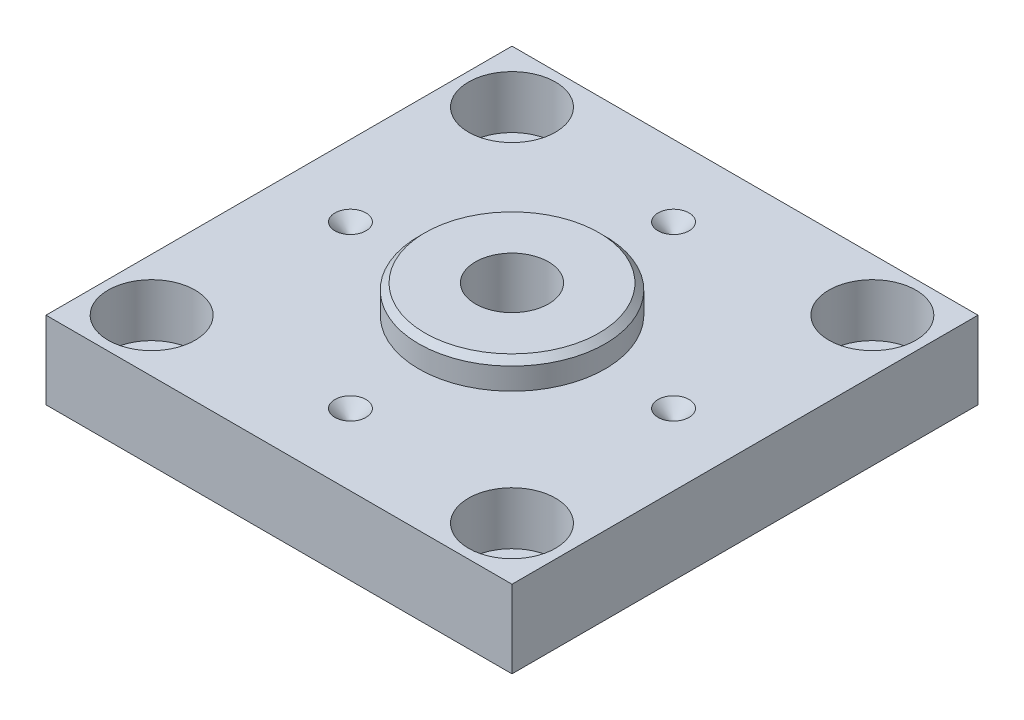
ISO-10303-21;
HEADER;
FILE_DESCRIPTION(('STEP AP214'),'2;1');
FILE_NAME('part.step','',(''),(''),'','','');
FILE_SCHEMA(('AUTOMOTIVE_DESIGN { 1 0 10303 214 1 1 1 1 }'));
ENDSEC;
DATA;
#1=APPLICATION_CONTEXT('core data for automotive mechanical design processes');
#2=APPLICATION_PROTOCOL_DEFINITION('international standard','automotive_design',2000,#1);
#3=PRODUCT_CONTEXT('',#1,'mechanical');
#4=PRODUCT('Part','Part','',(#3));
#5=PRODUCT_RELATED_PRODUCT_CATEGORY('part','',(#4));
#6=PRODUCT_DEFINITION_FORMATION('','',#4);
#7=PRODUCT_DEFINITION_CONTEXT('part definition',#1,'design');
#8=PRODUCT_DEFINITION('design','',#6,#7);
#9=PRODUCT_DEFINITION_SHAPE('','',#8);
#10=(LENGTH_UNIT() NAMED_UNIT(*) SI_UNIT(.MILLI.,.METRE.));
#11=(NAMED_UNIT(*) PLANE_ANGLE_UNIT() SI_UNIT($,.RADIAN.));
#12=(NAMED_UNIT(*) SI_UNIT($,.STERADIAN.) SOLID_ANGLE_UNIT());
#13=UNCERTAINTY_MEASURE_WITH_UNIT(LENGTH_MEASURE(1.E-05),#10,'distance_accuracy_value','');
#14=(GEOMETRIC_REPRESENTATION_CONTEXT(3) GLOBAL_UNCERTAINTY_ASSIGNED_CONTEXT((#13)) GLOBAL_UNIT_ASSIGNED_CONTEXT((#10,
#11,#12)) REPRESENTATION_CONTEXT('',''));
#15=CARTESIAN_POINT('',(0.,0.,0.));
#16=DIRECTION('',(0.,0.,1.));
#17=DIRECTION('',(1.,0.,0.));
#18=AXIS2_PLACEMENT_3D('',#15,#16,#17);
#19=CARTESIAN_POINT('',(75.,25.,-75.));
#20=DIRECTION('',(-1.,0.,0.));
#21=DIRECTION('',(0.,0.,1.));
#22=AXIS2_PLACEMENT_3D('',#19,#20,#21);
#23=PLANE('',#22);
#24=DIRECTION('',(0.,0.,-1.));
#25=VECTOR('',#24,1.);
#26=CARTESIAN_POINT('',(75.,0.,-75.));
#27=LINE('',#26,#25);
#28=CARTESIAN_POINT('',(75.,0.,75.));
#29=VERTEX_POINT('',#28);
#30=CARTESIAN_POINT('',(75.,0.,-75.));
#31=VERTEX_POINT('',#30);
#32=EDGE_CURVE('E177',#29,#31,#27,.T.);
#33=ORIENTED_EDGE('',*,*,#32,.T.);
#34=DIRECTION('',(0.,-1.,0.));
#35=VECTOR('',#34,1.);
#36=CARTESIAN_POINT('',(75.,25.,-75.));
#37=LINE('',#36,#35);
#38=CARTESIAN_POINT('',(75.,25.,-75.));
#39=VERTEX_POINT('',#38);
#40=EDGE_CURVE('E181',#39,#31,#37,.T.);
#41=ORIENTED_EDGE('',*,*,#40,.F.);
#42=DIRECTION('',(0.,0.,-1.));
#43=VECTOR('',#42,1.);
#44=CARTESIAN_POINT('',(75.,25.,-75.));
#45=LINE('',#44,#43);
#46=CARTESIAN_POINT('',(75.,25.,75.));
#47=VERTEX_POINT('',#46);
#48=EDGE_CURVE('E182',#47,#39,#45,.T.);
#49=ORIENTED_EDGE('',*,*,#48,.F.);
#50=DIRECTION('',(0.,-1.,0.));
#51=VECTOR('',#50,1.);
#52=CARTESIAN_POINT('',(75.,25.,75.));
#53=LINE('',#52,#51);
#54=EDGE_CURVE('E188',#47,#29,#53,.T.);
#55=ORIENTED_EDGE('',*,*,#54,.T.);
#56=EDGE_LOOP('',(#33,#41,#49,#55));
#57=FACE_BOUND('',#56,.T.);
#58=ADVANCED_FACE('F40',(#57),#23,.F.);
#59=CARTESIAN_POINT('',(-75.,25.,-75.));
#60=DIRECTION('',(0.,0.,1.));
#61=DIRECTION('',(1.,0.,0.));
#62=AXIS2_PLACEMENT_3D('',#59,#60,#61);
#63=PLANE('',#62);
#64=DIRECTION('',(-1.,0.,0.));
#65=VECTOR('',#64,1.);
#66=CARTESIAN_POINT('',(-75.,0.,-75.));
#67=LINE('',#66,#65);
#68=CARTESIAN_POINT('',(-75.,0.,-75.));
#69=VERTEX_POINT('',#68);
#70=EDGE_CURVE('E191',#31,#69,#67,.T.);
#71=ORIENTED_EDGE('',*,*,#70,.T.);
#72=DIRECTION('',(0.,-1.,0.));
#73=VECTOR('',#72,1.);
#74=CARTESIAN_POINT('',(-75.,25.,-75.));
#75=LINE('',#74,#73);
#76=CARTESIAN_POINT('',(-75.,25.,-75.));
#77=VERTEX_POINT('',#76);
#78=EDGE_CURVE('E198',#77,#69,#75,.T.);
#79=ORIENTED_EDGE('',*,*,#78,.F.);
#80=DIRECTION('',(-1.,0.,0.));
#81=VECTOR('',#80,1.);
#82=CARTESIAN_POINT('',(-75.,25.,-75.));
#83=LINE('',#82,#81);
#84=EDGE_CURVE('E90',#39,#77,#83,.T.);
#85=ORIENTED_EDGE('',*,*,#84,.F.);
#86=ORIENTED_EDGE('',*,*,#40,.T.);
#87=EDGE_LOOP('',(#71,#79,#85,#86));
#88=FACE_BOUND('',#87,.T.);
#89=ADVANCED_FACE('F220',(#88),#63,.F.);
#90=CARTESIAN_POINT('',(-75.,25.,-75.));
#91=DIRECTION('',(1.,0.,0.));
#92=DIRECTION('',(0.,0.,-1.));
#93=AXIS2_PLACEMENT_3D('',#90,#91,#92);
#94=PLANE('',#93);
#95=DIRECTION('',(0.,0.,1.));
#96=VECTOR('',#95,1.);
#97=CARTESIAN_POINT('',(-75.,0.,-75.));
#98=LINE('',#97,#96);
#99=CARTESIAN_POINT('',(-75.,0.,75.));
#100=VERTEX_POINT('',#99);
#101=EDGE_CURVE('E76',#69,#100,#98,.T.);
#102=ORIENTED_EDGE('',*,*,#101,.T.);
#103=DIRECTION('',(0.,-1.,0.));
#104=VECTOR('',#103,1.);
#105=CARTESIAN_POINT('',(-75.,25.,75.));
#106=LINE('',#105,#104);
#107=CARTESIAN_POINT('',(-75.,25.,75.));
#108=VERTEX_POINT('',#107);
#109=EDGE_CURVE('E196',#108,#100,#106,.T.);
#110=ORIENTED_EDGE('',*,*,#109,.F.);
#111=DIRECTION('',(0.,0.,1.));
#112=VECTOR('',#111,1.);
#113=CARTESIAN_POINT('',(-75.,25.,-75.));
#114=LINE('',#113,#112);
#115=EDGE_CURVE('E185',#77,#108,#114,.T.);
#116=ORIENTED_EDGE('',*,*,#115,.F.);
#117=ORIENTED_EDGE('',*,*,#78,.T.);
#118=EDGE_LOOP('',(#102,#110,#116,#117));
#119=FACE_BOUND('',#118,.T.);
#120=ADVANCED_FACE('F225',(#119),#94,.F.);
#121=CARTESIAN_POINT('',(-75.,25.,75.));
#122=DIRECTION('',(0.,0.,-1.));
#123=DIRECTION('',(-1.,0.,0.));
#124=AXIS2_PLACEMENT_3D('',#121,#122,#123);
#125=PLANE('',#124);
#126=DIRECTION('',(1.,0.,0.));
#127=VECTOR('',#126,1.);
#128=CARTESIAN_POINT('',(-75.,0.,75.));
#129=LINE('',#128,#127);
#130=EDGE_CURVE('E82',#100,#29,#129,.T.);
#131=ORIENTED_EDGE('',*,*,#130,.T.);
#132=ORIENTED_EDGE('',*,*,#54,.F.);
#133=DIRECTION('',(1.,0.,0.));
#134=VECTOR('',#133,1.);
#135=CARTESIAN_POINT('',(-75.,25.,75.));
#136=LINE('',#135,#134);
#137=EDGE_CURVE('E58',#108,#47,#136,.T.);
#138=ORIENTED_EDGE('',*,*,#137,.F.);
#139=ORIENTED_EDGE('',*,*,#109,.T.);
#140=EDGE_LOOP('',(#131,#132,#138,#139));
#141=FACE_BOUND('',#140,.T.);
#142=ADVANCED_FACE('F230',(#141),#125,.F.);
#143=CARTESIAN_POINT('',(0.,25.,0.));
#144=DIRECTION('',(0.,1.,0.));
#145=DIRECTION('',(0.,0.,1.));
#146=AXIS2_PLACEMENT_3D('',#143,#144,#145);
#147=PLANE('',#146);
#148=CARTESIAN_POINT('',(-5.44671088859529E-13,25.,-52.));
#149=DIRECTION('',(0.,-1.,0.));
#150=DIRECTION('',(0.,0.,1.));
#151=AXIS2_PLACEMENT_3D('',#148,#149,#150);
#152=CIRCLE('',#151,5.);
#153=CARTESIAN_POINT('',(-4.92298868776882E-13,25.,-47.));
#154=VERTEX_POINT('',#153);
#155=EDGE_CURVE('E110',#154,#154,#152,.T.);
#156=ORIENTED_EDGE('',*,*,#155,.T.);
#157=EDGE_LOOP('',(#156));
#158=FACE_BOUND('',#157,.T.);
#159=CARTESIAN_POINT('',(52.,25.,0.));
#160=DIRECTION('',(0.,-1.,0.));
#161=DIRECTION('',(-1.,0.,0.));
#162=AXIS2_PLACEMENT_3D('',#159,#160,#161);
#163=CIRCLE('',#162,5.);
#164=CARTESIAN_POINT('',(47.,25.,0.));
#165=VERTEX_POINT('',#164);
#166=EDGE_CURVE('E112',#165,#165,#163,.T.);
#167=ORIENTED_EDGE('',*,*,#166,.T.);
#168=EDGE_LOOP('',(#167));
#169=FACE_BOUND('',#168,.T.);
#170=CARTESIAN_POINT('',(1.81557029619843E-13,25.,52.));
#171=DIRECTION('',(0.,-1.,0.));
#172=DIRECTION('',(0.,0.,-1.));
#173=AXIS2_PLACEMENT_3D('',#170,#171,#172);
#174=CIRCLE('',#173,5.);
#175=CARTESIAN_POINT('',(1.64099622925627E-13,25.,47.));
#176=VERTEX_POINT('',#175);
#177=EDGE_CURVE('E115',#176,#176,#174,.T.);
#178=ORIENTED_EDGE('',*,*,#177,.T.);
#179=EDGE_LOOP('',(#178));
#180=FACE_BOUND('',#179,.T.);
#181=CARTESIAN_POINT('',(-52.,25.,0.));
#182=DIRECTION('',(0.,-1.,0.));
#183=DIRECTION('',(1.,0.,0.));
#184=AXIS2_PLACEMENT_3D('',#181,#182,#183);
#185=CIRCLE('',#184,5.);
#186=CARTESIAN_POINT('',(-47.,25.,0.));
#187=VERTEX_POINT('',#186);
#188=EDGE_CURVE('E126',#187,#187,#185,.T.);
#189=ORIENTED_EDGE('',*,*,#188,.T.);
#190=EDGE_LOOP('',(#189));
#191=FACE_BOUND('',#190,.T.);
#192=CARTESIAN_POINT('',(58.,25.,-58.));
#193=DIRECTION('',(0.,1.,0.));
#194=DIRECTION('',(0.,0.,1.));
#195=AXIS2_PLACEMENT_3D('',#192,#193,#194);
#196=CIRCLE('',#195,14.);
#197=CARTESIAN_POINT('',(58.,25.,-44.));
#198=VERTEX_POINT('',#197);
#199=EDGE_CURVE('E129',#198,#198,#196,.T.);
#200=ORIENTED_EDGE('',*,*,#199,.F.);
#201=EDGE_LOOP('',(#200));
#202=FACE_BOUND('',#201,.T.);
#203=CARTESIAN_POINT('',(58.,25.,58.));
#204=DIRECTION('',(0.,1.,0.));
#205=DIRECTION('',(0.,0.,1.));
#206=AXIS2_PLACEMENT_3D('',#203,#204,#205);
#207=CIRCLE('',#206,14.);
#208=CARTESIAN_POINT('',(58.,25.,72.));
#209=VERTEX_POINT('',#208);
#210=EDGE_CURVE('E141',#209,#209,#207,.T.);
#211=ORIENTED_EDGE('',*,*,#210,.F.);
#212=EDGE_LOOP('',(#211));
#213=FACE_BOUND('',#212,.T.);
#214=CARTESIAN_POINT('',(-58.,25.,-58.));
#215=DIRECTION('',(0.,1.,0.));
#216=DIRECTION('',(0.,0.,1.));
#217=AXIS2_PLACEMENT_3D('',#214,#215,#216);
#218=CIRCLE('',#217,14.);
#219=CARTESIAN_POINT('',(-58.,25.,-44.));
#220=VERTEX_POINT('',#219);
#221=EDGE_CURVE('E153',#220,#220,#218,.T.);
#222=ORIENTED_EDGE('',*,*,#221,.F.);
#223=EDGE_LOOP('',(#222));
#224=FACE_BOUND('',#223,.T.);
#225=CARTESIAN_POINT('',(-58.,25.,58.));
#226=DIRECTION('',(0.,1.,0.));
#227=DIRECTION('',(0.,0.,1.));
#228=AXIS2_PLACEMENT_3D('',#225,#226,#227);
#229=CIRCLE('',#228,14.);
#230=CARTESIAN_POINT('',(-58.,25.,72.0000000000001));
#231=VERTEX_POINT('',#230);
#232=EDGE_CURVE('E165',#231,#231,#229,.T.);
#233=ORIENTED_EDGE('',*,*,#232,.F.);
#234=EDGE_LOOP('',(#233));
#235=FACE_BOUND('',#234,.T.);
#236=CARTESIAN_POINT('',(0.,25.,0.));
#237=DIRECTION('',(0.,1.,0.));
#238=DIRECTION('',(0.,0.,1.));
#239=AXIS2_PLACEMENT_3D('',#236,#237,#238);
#240=CIRCLE('',#239,30.);
#241=CARTESIAN_POINT('',(0.,25.,30.));
#242=VERTEX_POINT('',#241);
#243=EDGE_CURVE('E178',#242,#242,#240,.T.);
#244=ORIENTED_EDGE('',*,*,#243,.F.);
#245=EDGE_LOOP('',(#244));
#246=FACE_BOUND('',#245,.T.);
#247=ORIENTED_EDGE('',*,*,#48,.T.);
#248=ORIENTED_EDGE('',*,*,#84,.T.);
#249=ORIENTED_EDGE('',*,*,#115,.T.);
#250=ORIENTED_EDGE('',*,*,#137,.T.);
#251=EDGE_LOOP('',(#247,#248,#249,#250));
#252=FACE_BOUND('',#251,.T.);
#253=ADVANCED_FACE('F233',(#158,#169,#180,#191,#202,#213,#224,#235,#246,#252),#147,.T.);
#254=CARTESIAN_POINT('',(0.,0.,0.));
#255=DIRECTION('',(0.,1.,0.));
#256=DIRECTION('',(0.,0.,1.));
#257=AXIS2_PLACEMENT_3D('',#254,#255,#256);
#258=PLANE('',#257);
#259=CARTESIAN_POINT('',(0.,0.,0.));
#260=DIRECTION('',(0.,1.,0.));
#261=DIRECTION('',(0.,0.,1.));
#262=AXIS2_PLACEMENT_3D('',#259,#260,#261);
#263=CIRCLE('',#262,11.75);
#264=CARTESIAN_POINT('',(0.,0.,11.75));
#265=VERTEX_POINT('',#264);
#266=EDGE_CURVE('E123',#265,#265,#263,.T.);
#267=ORIENTED_EDGE('',*,*,#266,.T.);
#268=EDGE_LOOP('',(#267));
#269=FACE_BOUND('',#268,.T.);
#270=CARTESIAN_POINT('',(58.,0.,-58.));
#271=DIRECTION('',(0.,1.,0.));
#272=DIRECTION('',(0.,0.,1.));
#273=AXIS2_PLACEMENT_3D('',#270,#271,#272);
#274=CIRCLE('',#273,8.50000000000001);
#275=CARTESIAN_POINT('',(58.,0.,-49.5));
#276=VERTEX_POINT('',#275);
#277=EDGE_CURVE('E138',#276,#276,#274,.T.);
#278=ORIENTED_EDGE('',*,*,#277,.T.);
#279=EDGE_LOOP('',(#278));
#280=FACE_BOUND('',#279,.T.);
#281=CARTESIAN_POINT('',(58.,0.,58.));
#282=DIRECTION('',(0.,1.,0.));
#283=DIRECTION('',(0.,0.,1.));
#284=AXIS2_PLACEMENT_3D('',#281,#282,#283);
#285=CIRCLE('',#284,8.50000000000001);
#286=CARTESIAN_POINT('',(58.,0.,66.5));
#287=VERTEX_POINT('',#286);
#288=EDGE_CURVE('E150',#287,#287,#285,.T.);
#289=ORIENTED_EDGE('',*,*,#288,.T.);
#290=EDGE_LOOP('',(#289));
#291=FACE_BOUND('',#290,.T.);
#292=CARTESIAN_POINT('',(-58.,0.,-58.));
#293=DIRECTION('',(0.,1.,0.));
#294=DIRECTION('',(0.,0.,1.));
#295=AXIS2_PLACEMENT_3D('',#292,#293,#294);
#296=CIRCLE('',#295,8.50000000000001);
#297=CARTESIAN_POINT('',(-58.,0.,-49.5));
#298=VERTEX_POINT('',#297);
#299=EDGE_CURVE('E162',#298,#298,#296,.T.);
#300=ORIENTED_EDGE('',*,*,#299,.T.);
#301=EDGE_LOOP('',(#300));
#302=FACE_BOUND('',#301,.T.);
#303=CARTESIAN_POINT('',(-58.,0.,58.));
#304=DIRECTION('',(0.,1.,0.));
#305=DIRECTION('',(0.,0.,1.));
#306=AXIS2_PLACEMENT_3D('',#303,#304,#305);
#307=CIRCLE('',#306,8.50000000000001);
#308=CARTESIAN_POINT('',(-58.,0.,66.5));
#309=VERTEX_POINT('',#308);
#310=EDGE_CURVE('E174',#309,#309,#307,.T.);
#311=ORIENTED_EDGE('',*,*,#310,.T.);
#312=EDGE_LOOP('',(#311));
#313=FACE_BOUND('',#312,.T.);
#314=ORIENTED_EDGE('',*,*,#32,.F.);
#315=ORIENTED_EDGE('',*,*,#130,.F.);
#316=ORIENTED_EDGE('',*,*,#101,.F.);
#317=ORIENTED_EDGE('',*,*,#70,.F.);
#318=EDGE_LOOP('',(#314,#315,#316,#317));
#319=FACE_BOUND('',#318,.T.);
#320=ADVANCED_FACE('F234',(#269,#280,#291,#302,#313,#319),#258,.F.);
#321=CARTESIAN_POINT('',(0.,34.,0.));
#322=DIRECTION('',(0.,-1.,0.));
#323=DIRECTION('',(0.,0.,-1.));
#324=AXIS2_PLACEMENT_3D('',#321,#322,#323);
#325=CYLINDRICAL_SURFACE('',#324,30.);
#326=CARTESIAN_POINT('',(0.,32.,0.));
#327=DIRECTION('',(0.,1.,0.));
#328=DIRECTION('',(0.,0.,1.));
#329=AXIS2_PLACEMENT_3D('',#326,#327,#328);
#330=CIRCLE('',#329,30.);
#331=CARTESIAN_POINT('',(0.,32.,30.));
#332=VERTEX_POINT('',#331);
#333=EDGE_CURVE('E11',#332,#332,#330,.F.);
#334=ORIENTED_EDGE('',*,*,#333,.T.);
#335=EDGE_LOOP('',(#334));
#336=FACE_BOUND('',#335,.T.);
#337=ORIENTED_EDGE('',*,*,#243,.T.);
#338=EDGE_LOOP('',(#337));
#339=FACE_BOUND('',#338,.T.);
#340=ADVANCED_FACE('F215',(#336,#339),#325,.T.);
#341=CARTESIAN_POINT('',(0.,34.,0.));
#342=DIRECTION('',(0.,1.,0.));
#343=DIRECTION('',(0.,0.,1.));
#344=AXIS2_PLACEMENT_3D('',#341,#342,#343);
#345=PLANE('',#344);
#346=CARTESIAN_POINT('',(0.,34.,0.));
#347=DIRECTION('',(0.,1.,0.));
#348=DIRECTION('',(0.,0.,1.));
#349=AXIS2_PLACEMENT_3D('',#346,#347,#348);
#350=CIRCLE('',#349,11.75);
#351=CARTESIAN_POINT('',(0.,34.,11.75));
#352=VERTEX_POINT('',#351);
#353=EDGE_CURVE('E120',#352,#352,#350,.T.);
#354=ORIENTED_EDGE('',*,*,#353,.F.);
#355=EDGE_LOOP('',(#354));
#356=FACE_BOUND('',#355,.T.);
#357=CARTESIAN_POINT('',(0.,34.,0.));
#358=DIRECTION('',(0.,1.,0.));
#359=DIRECTION('',(0.,0.,1.));
#360=AXIS2_PLACEMENT_3D('',#357,#358,#359);
#361=CIRCLE('',#360,28.);
#362=CARTESIAN_POINT('',(0.,34.,28.));
#363=VERTEX_POINT('',#362);
#364=EDGE_CURVE('E50',#363,#363,#361,.T.);
#365=ORIENTED_EDGE('',*,*,#364,.T.);
#366=EDGE_LOOP('',(#365));
#367=FACE_BOUND('',#366,.T.);
#368=ADVANCED_FACE('F203',(#356,#367),#345,.T.);
#369=CARTESIAN_POINT('',(0.,34.,0.));
#370=DIRECTION('',(0.,-1.,0.));
#371=DIRECTION('',(0.,0.,-1.));
#372=AXIS2_PLACEMENT_3D('',#369,#370,#371);
#373=CONICAL_SURFACE('',#372,28.,0.785398163397451);
#374=ORIENTED_EDGE('',*,*,#333,.F.);
#375=EDGE_LOOP('',(#374));
#376=FACE_BOUND('',#375,.T.);
#377=ORIENTED_EDGE('',*,*,#364,.F.);
#378=EDGE_LOOP('',(#377));
#379=FACE_BOUND('',#378,.T.);
#380=ADVANCED_FACE('F43',(#376,#379),#373,.T.);
#381=CARTESIAN_POINT('',(-58.,25.,58.));
#382=DIRECTION('',(0.,1.,0.));
#383=DIRECTION('',(0.,0.,1.));
#384=AXIS2_PLACEMENT_3D('',#381,#382,#383);
#385=CYLINDRICAL_SURFACE('',#384,8.50000000000001);
#386=ORIENTED_EDGE('',*,*,#310,.F.);
#387=EDGE_LOOP('',(#386));
#388=FACE_BOUND('',#387,.T.);
#389=CARTESIAN_POINT('',(-58.,8.,58.));
#390=DIRECTION('',(0.,1.,0.));
#391=DIRECTION('',(0.,0.,1.));
#392=AXIS2_PLACEMENT_3D('',#389,#390,#391);
#393=CIRCLE('',#392,8.50000000000001);
#394=CARTESIAN_POINT('',(-58.,8.,66.5000000000001));
#395=VERTEX_POINT('',#394);
#396=EDGE_CURVE('E171',#395,#395,#393,.T.);
#397=ORIENTED_EDGE('',*,*,#396,.T.);
#398=EDGE_LOOP('',(#397));
#399=FACE_BOUND('',#398,.T.);
#400=ADVANCED_FACE('F206',(#388,#399),#385,.F.);
#401=CARTESIAN_POINT('',(-49.5,8.,58.));
#402=DIRECTION('',(0.,-1.,0.));
#403=DIRECTION('',(0.,0.,-1.));
#404=AXIS2_PLACEMENT_3D('',#401,#402,#403);
#405=PLANE('',#404);
#406=ORIENTED_EDGE('',*,*,#396,.F.);
#407=EDGE_LOOP('',(#406));
#408=FACE_BOUND('',#407,.T.);
#409=CARTESIAN_POINT('',(-58.,8.,58.));
#410=DIRECTION('',(0.,1.,0.));
#411=DIRECTION('',(0.,0.,1.));
#412=AXIS2_PLACEMENT_3D('',#409,#410,#411);
#413=CIRCLE('',#412,14.);
#414=CARTESIAN_POINT('',(-58.,8.,72.0000000000001));
#415=VERTEX_POINT('',#414);
#416=EDGE_CURVE('E168',#415,#415,#413,.T.);
#417=ORIENTED_EDGE('',*,*,#416,.T.);
#418=EDGE_LOOP('',(#417));
#419=FACE_BOUND('',#418,.T.);
#420=ADVANCED_FACE('F212',(#408,#419),#405,.F.);
#421=CARTESIAN_POINT('',(-58.,25.,58.));
#422=DIRECTION('',(0.,1.,0.));
#423=DIRECTION('',(0.,0.,1.));
#424=AXIS2_PLACEMENT_3D('',#421,#422,#423);
#425=CYLINDRICAL_SURFACE('',#424,14.);
#426=ORIENTED_EDGE('',*,*,#416,.F.);
#427=EDGE_LOOP('',(#426));
#428=FACE_BOUND('',#427,.T.);
#429=ORIENTED_EDGE('',*,*,#232,.T.);
#430=EDGE_LOOP('',(#429));
#431=FACE_BOUND('',#430,.T.);
#432=ADVANCED_FACE('F245',(#428,#431),#425,.F.);
#433=CARTESIAN_POINT('',(-58.,25.,-58.));
#434=DIRECTION('',(0.,1.,0.));
#435=DIRECTION('',(0.,0.,1.));
#436=AXIS2_PLACEMENT_3D('',#433,#434,#435);
#437=CYLINDRICAL_SURFACE('',#436,8.50000000000001);
#438=ORIENTED_EDGE('',*,*,#299,.F.);
#439=EDGE_LOOP('',(#438));
#440=FACE_BOUND('',#439,.T.);
#441=CARTESIAN_POINT('',(-58.,8.,-58.));
#442=DIRECTION('',(0.,1.,0.));
#443=DIRECTION('',(0.,0.,1.));
#444=AXIS2_PLACEMENT_3D('',#441,#442,#443);
#445=CIRCLE('',#444,8.50000000000001);
#446=CARTESIAN_POINT('',(-58.,8.,-49.5));
#447=VERTEX_POINT('',#446);
#448=EDGE_CURVE('E159',#447,#447,#445,.T.);
#449=ORIENTED_EDGE('',*,*,#448,.T.);
#450=EDGE_LOOP('',(#449));
#451=FACE_BOUND('',#450,.T.);
#452=ADVANCED_FACE('F249',(#440,#451),#437,.F.);
#453=CARTESIAN_POINT('',(-49.5,8.,-58.));
#454=DIRECTION('',(0.,-1.,0.));
#455=DIRECTION('',(0.,0.,-1.));
#456=AXIS2_PLACEMENT_3D('',#453,#454,#455);
#457=PLANE('',#456);
#458=ORIENTED_EDGE('',*,*,#448,.F.);
#459=EDGE_LOOP('',(#458));
#460=FACE_BOUND('',#459,.T.);
#461=CARTESIAN_POINT('',(-58.,8.,-58.));
#462=DIRECTION('',(0.,1.,0.));
#463=DIRECTION('',(0.,0.,1.));
#464=AXIS2_PLACEMENT_3D('',#461,#462,#463);
#465=CIRCLE('',#464,14.);
#466=CARTESIAN_POINT('',(-58.,8.,-44.));
#467=VERTEX_POINT('',#466);
#468=EDGE_CURVE('E156',#467,#467,#465,.T.);
#469=ORIENTED_EDGE('',*,*,#468,.T.);
#470=EDGE_LOOP('',(#469));
#471=FACE_BOUND('',#470,.T.);
#472=ADVANCED_FACE('F253',(#460,#471),#457,.F.);
#473=CARTESIAN_POINT('',(-58.,25.,-58.));
#474=DIRECTION('',(0.,1.,0.));
#475=DIRECTION('',(0.,0.,1.));
#476=AXIS2_PLACEMENT_3D('',#473,#474,#475);
#477=CYLINDRICAL_SURFACE('',#476,14.);
#478=ORIENTED_EDGE('',*,*,#468,.F.);
#479=EDGE_LOOP('',(#478));
#480=FACE_BOUND('',#479,.T.);
#481=ORIENTED_EDGE('',*,*,#221,.T.);
#482=EDGE_LOOP('',(#481));
#483=FACE_BOUND('',#482,.T.);
#484=ADVANCED_FACE('F257',(#480,#483),#477,.F.);
#485=CARTESIAN_POINT('',(58.,25.,58.));
#486=DIRECTION('',(0.,1.,0.));
#487=DIRECTION('',(0.,0.,1.));
#488=AXIS2_PLACEMENT_3D('',#485,#486,#487);
#489=CYLINDRICAL_SURFACE('',#488,8.50000000000001);
#490=ORIENTED_EDGE('',*,*,#288,.F.);
#491=EDGE_LOOP('',(#490));
#492=FACE_BOUND('',#491,.T.);
#493=CARTESIAN_POINT('',(58.,8.,58.));
#494=DIRECTION('',(0.,1.,0.));
#495=DIRECTION('',(0.,0.,1.));
#496=AXIS2_PLACEMENT_3D('',#493,#494,#495);
#497=CIRCLE('',#496,8.50000000000001);
#498=CARTESIAN_POINT('',(58.,8.,66.5));
#499=VERTEX_POINT('',#498);
#500=EDGE_CURVE('E147',#499,#499,#497,.T.);
#501=ORIENTED_EDGE('',*,*,#500,.T.);
#502=EDGE_LOOP('',(#501));
#503=FACE_BOUND('',#502,.T.);
#504=ADVANCED_FACE('F261',(#492,#503),#489,.F.);
#505=CARTESIAN_POINT('',(66.5,8.,58.));
#506=DIRECTION('',(0.,-1.,0.));
#507=DIRECTION('',(0.,0.,-1.));
#508=AXIS2_PLACEMENT_3D('',#505,#506,#507);
#509=PLANE('',#508);
#510=ORIENTED_EDGE('',*,*,#500,.F.);
#511=EDGE_LOOP('',(#510));
#512=FACE_BOUND('',#511,.T.);
#513=CARTESIAN_POINT('',(58.,8.,58.));
#514=DIRECTION('',(0.,1.,0.));
#515=DIRECTION('',(0.,0.,1.));
#516=AXIS2_PLACEMENT_3D('',#513,#514,#515);
#517=CIRCLE('',#516,14.);
#518=CARTESIAN_POINT('',(58.,8.,72.));
#519=VERTEX_POINT('',#518);
#520=EDGE_CURVE('E144',#519,#519,#517,.T.);
#521=ORIENTED_EDGE('',*,*,#520,.T.);
#522=EDGE_LOOP('',(#521));
#523=FACE_BOUND('',#522,.T.);
#524=ADVANCED_FACE('F265',(#512,#523),#509,.F.);
#525=CARTESIAN_POINT('',(58.,25.,58.));
#526=DIRECTION('',(0.,1.,0.));
#527=DIRECTION('',(0.,0.,1.));
#528=AXIS2_PLACEMENT_3D('',#525,#526,#527);
#529=CYLINDRICAL_SURFACE('',#528,14.);
#530=ORIENTED_EDGE('',*,*,#520,.F.);
#531=EDGE_LOOP('',(#530));
#532=FACE_BOUND('',#531,.T.);
#533=ORIENTED_EDGE('',*,*,#210,.T.);
#534=EDGE_LOOP('',(#533));
#535=FACE_BOUND('',#534,.T.);
#536=ADVANCED_FACE('F269',(#532,#535),#529,.F.);
#537=CARTESIAN_POINT('',(58.,25.,-58.));
#538=DIRECTION('',(0.,1.,0.));
#539=DIRECTION('',(0.,0.,1.));
#540=AXIS2_PLACEMENT_3D('',#537,#538,#539);
#541=CYLINDRICAL_SURFACE('',#540,8.50000000000001);
#542=ORIENTED_EDGE('',*,*,#277,.F.);
#543=EDGE_LOOP('',(#542));
#544=FACE_BOUND('',#543,.T.);
#545=CARTESIAN_POINT('',(58.,8.,-58.));
#546=DIRECTION('',(0.,1.,0.));
#547=DIRECTION('',(0.,0.,1.));
#548=AXIS2_PLACEMENT_3D('',#545,#546,#547);
#549=CIRCLE('',#548,8.50000000000001);
#550=CARTESIAN_POINT('',(58.,8.,-49.5));
#551=VERTEX_POINT('',#550);
#552=EDGE_CURVE('E135',#551,#551,#549,.T.);
#553=ORIENTED_EDGE('',*,*,#552,.T.);
#554=EDGE_LOOP('',(#553));
#555=FACE_BOUND('',#554,.T.);
#556=ADVANCED_FACE('F273',(#544,#555),#541,.F.);
#557=CARTESIAN_POINT('',(66.5,8.,-58.));
#558=DIRECTION('',(0.,-1.,0.));
#559=DIRECTION('',(0.,0.,-1.));
#560=AXIS2_PLACEMENT_3D('',#557,#558,#559);
#561=PLANE('',#560);
#562=ORIENTED_EDGE('',*,*,#552,.F.);
#563=EDGE_LOOP('',(#562));
#564=FACE_BOUND('',#563,.T.);
#565=CARTESIAN_POINT('',(58.,8.,-58.));
#566=DIRECTION('',(0.,1.,0.));
#567=DIRECTION('',(0.,0.,1.));
#568=AXIS2_PLACEMENT_3D('',#565,#566,#567);
#569=CIRCLE('',#568,14.);
#570=CARTESIAN_POINT('',(58.,8.,-44.));
#571=VERTEX_POINT('',#570);
#572=EDGE_CURVE('E132',#571,#571,#569,.T.);
#573=ORIENTED_EDGE('',*,*,#572,.T.);
#574=EDGE_LOOP('',(#573));
#575=FACE_BOUND('',#574,.T.);
#576=ADVANCED_FACE('F277',(#564,#575),#561,.F.);
#577=CARTESIAN_POINT('',(58.,25.,-58.));
#578=DIRECTION('',(0.,1.,0.));
#579=DIRECTION('',(0.,0.,1.));
#580=AXIS2_PLACEMENT_3D('',#577,#578,#579);
#581=CYLINDRICAL_SURFACE('',#580,14.);
#582=ORIENTED_EDGE('',*,*,#572,.F.);
#583=EDGE_LOOP('',(#582));
#584=FACE_BOUND('',#583,.T.);
#585=ORIENTED_EDGE('',*,*,#199,.T.);
#586=EDGE_LOOP('',(#585));
#587=FACE_BOUND('',#586,.T.);
#588=ADVANCED_FACE('F281',(#584,#587),#581,.F.);
#589=CARTESIAN_POINT('',(-52.,25.,0.));
#590=DIRECTION('',(0.,1.,0.));
#591=DIRECTION('',(-1.,0.,0.));
#592=AXIS2_PLACEMENT_3D('',#589,#590,#591);
#593=CONICAL_SURFACE('',#592,5.,0.785398163397449);
#594=CARTESIAN_POINT('',(-52.,20.,0.));
#595=VERTEX_POINT('',#594);
#596=VERTEX_LOOP('',#595);
#597=FACE_BOUND('',#596,.T.);
#598=ORIENTED_EDGE('',*,*,#188,.F.);
#599=EDGE_LOOP('',(#598));
#600=FACE_BOUND('',#599,.T.);
#601=ADVANCED_FACE('F285',(#597,#600),#593,.F.);
#602=CARTESIAN_POINT('',(0.,34.,0.));
#603=DIRECTION('',(0.,1.,0.));
#604=DIRECTION('',(0.,0.,1.));
#605=AXIS2_PLACEMENT_3D('',#602,#603,#604);
#606=CYLINDRICAL_SURFACE('',#605,11.75);
#607=ORIENTED_EDGE('',*,*,#266,.F.);
#608=EDGE_LOOP('',(#607));
#609=FACE_BOUND('',#608,.T.);
#610=ORIENTED_EDGE('',*,*,#353,.T.);
#611=EDGE_LOOP('',(#610));
#612=FACE_BOUND('',#611,.T.);
#613=ADVANCED_FACE('F289',(#609,#612),#606,.F.);
#614=CARTESIAN_POINT('',(1.81557029619843E-13,25.,52.));
#615=DIRECTION('',(0.,1.,0.));
#616=DIRECTION('',(0.,0.,1.));
#617=AXIS2_PLACEMENT_3D('',#614,#615,#616);
#618=CONICAL_SURFACE('',#617,5.,0.785398163397449);
#619=CARTESIAN_POINT('',(1.81557029619843E-13,20.,52.));
#620=VERTEX_POINT('',#619);
#621=VERTEX_LOOP('',#620);
#622=FACE_BOUND('',#621,.T.);
#623=ORIENTED_EDGE('',*,*,#177,.F.);
#624=EDGE_LOOP('',(#623));
#625=FACE_BOUND('',#624,.T.);
#626=ADVANCED_FACE('F293',(#622,#625),#618,.F.);
#627=CARTESIAN_POINT('',(52.,25.,0.));
#628=DIRECTION('',(0.,1.,0.));
#629=DIRECTION('',(1.,0.,0.));
#630=AXIS2_PLACEMENT_3D('',#627,#628,#629);
#631=CONICAL_SURFACE('',#630,5.,0.785398163397449);
#632=CARTESIAN_POINT('',(52.,20.,0.));
#633=VERTEX_POINT('',#632);
#634=VERTEX_LOOP('',#633);
#635=FACE_BOUND('',#634,.T.);
#636=ORIENTED_EDGE('',*,*,#166,.F.);
#637=EDGE_LOOP('',(#636));
#638=FACE_BOUND('',#637,.T.);
#639=ADVANCED_FACE('F106',(#635,#638),#631,.F.);
#640=CARTESIAN_POINT('',(-5.44671088859529E-13,25.,-52.));
#641=DIRECTION('',(0.,1.,0.));
#642=DIRECTION('',(0.,0.,-1.));
#643=AXIS2_PLACEMENT_3D('',#640,#641,#642);
#644=CONICAL_SURFACE('',#643,5.,0.785398163397449);
#645=CARTESIAN_POINT('',(-5.44671088859529E-13,20.,-52.));
#646=VERTEX_POINT('',#645);
#647=VERTEX_LOOP('',#646);
#648=FACE_BOUND('',#647,.T.);
#649=ORIENTED_EDGE('',*,*,#155,.F.);
#650=EDGE_LOOP('',(#649));
#651=FACE_BOUND('',#650,.T.);
#652=ADVANCED_FACE('F103',(#648,#651),#644,.F.);
#653=CLOSED_SHELL('',(#58,#89,#120,#142,#253,#320,#340,#368,#380,#400,#420,#432,#452,#472,#484,
#504,#524,#536,#556,#576,#588,#601,#613,#626,#639,#652));
#654=MANIFOLD_SOLID_BREP('B2',#653);
#655=ADVANCED_BREP_SHAPE_REPRESENTATION('',(#18,#654),#14);
#656=SHAPE_DEFINITION_REPRESENTATION(#9,#655);
ENDSEC;
END-ISO-10303-21;
